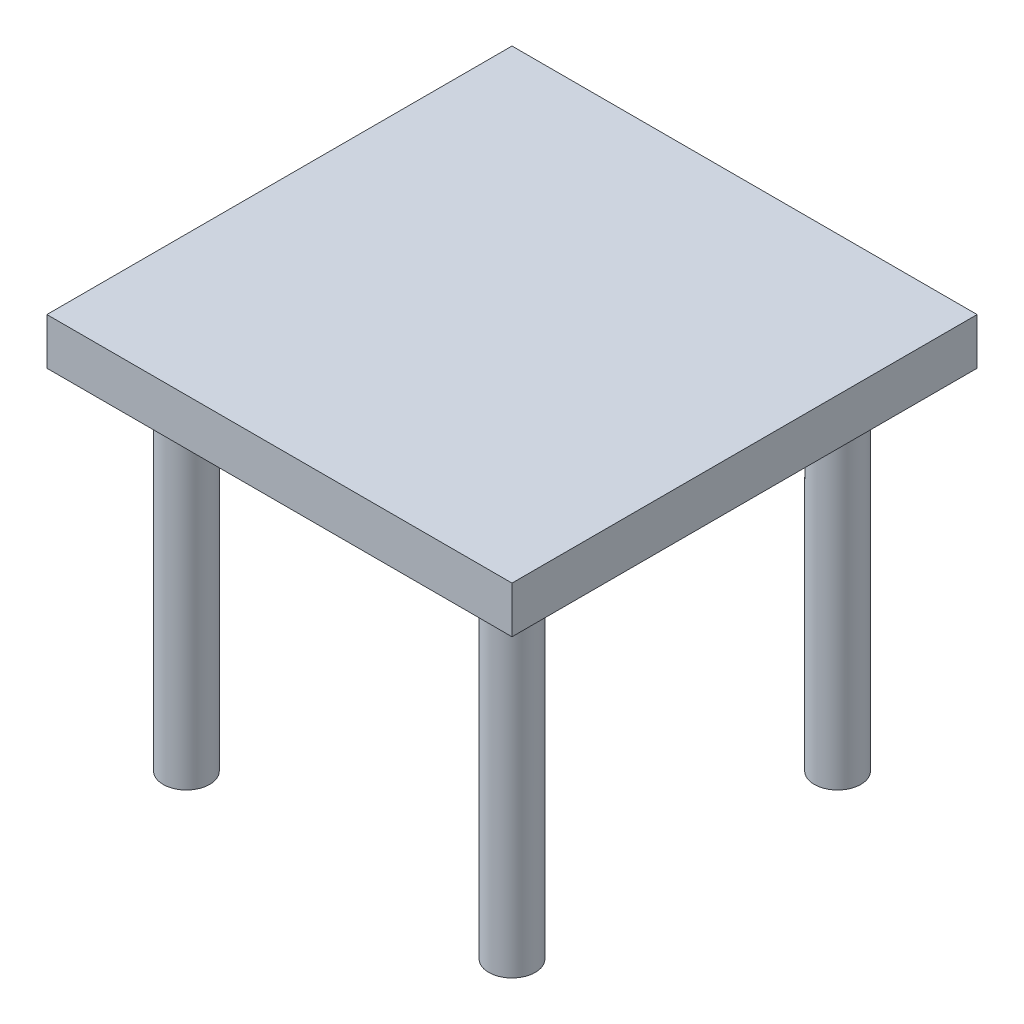
ISO-10303-21;
HEADER;
FILE_DESCRIPTION(('STEP AP214'),'2;1');
FILE_NAME('part.step','',(''),(''),'','','');
FILE_SCHEMA(('AUTOMOTIVE_DESIGN { 1 0 10303 214 1 1 1 1 }'));
ENDSEC;
DATA;
#1=APPLICATION_CONTEXT('core data for automotive mechanical design processes');
#2=APPLICATION_PROTOCOL_DEFINITION('international standard','automotive_design',2000,#1);
#3=PRODUCT_CONTEXT('',#1,'mechanical');
#4=PRODUCT('Part','Part','',(#3));
#5=PRODUCT_RELATED_PRODUCT_CATEGORY('part','',(#4));
#6=PRODUCT_DEFINITION_FORMATION('','',#4);
#7=PRODUCT_DEFINITION_CONTEXT('part definition',#1,'design');
#8=PRODUCT_DEFINITION('design','',#6,#7);
#9=PRODUCT_DEFINITION_SHAPE('','',#8);
#10=(LENGTH_UNIT() NAMED_UNIT(*) SI_UNIT(.MILLI.,.METRE.));
#11=(NAMED_UNIT(*) PLANE_ANGLE_UNIT() SI_UNIT($,.RADIAN.));
#12=(NAMED_UNIT(*) SI_UNIT($,.STERADIAN.) SOLID_ANGLE_UNIT());
#13=UNCERTAINTY_MEASURE_WITH_UNIT(LENGTH_MEASURE(1.E-05),#10,'distance_accuracy_value','');
#14=(GEOMETRIC_REPRESENTATION_CONTEXT(3) GLOBAL_UNCERTAINTY_ASSIGNED_CONTEXT((#13)) GLOBAL_UNIT_ASSIGNED_CONTEXT((#10,
#11,#12)) REPRESENTATION_CONTEXT('',''));
#15=CARTESIAN_POINT('',(0.,0.,0.));
#16=DIRECTION('',(0.,0.,1.));
#17=DIRECTION('',(1.,0.,0.));
#18=AXIS2_PLACEMENT_3D('',#15,#16,#17);
#19=CARTESIAN_POINT('',(-100.,170.,100.));
#20=DIRECTION('',(1.,0.,0.));
#21=DIRECTION('',(0.,0.,-1.));
#22=AXIS2_PLACEMENT_3D('',#19,#20,#21);
#23=PLANE('',#22);
#24=DIRECTION('',(0.,0.,1.));
#25=VECTOR('',#24,1.);
#26=CARTESIAN_POINT('',(-100.,150.,100.));
#27=LINE('',#26,#25);
#28=CARTESIAN_POINT('',(-100.,150.,-100.));
#29=VERTEX_POINT('',#28);
#30=CARTESIAN_POINT('',(-100.,150.,100.));
#31=VERTEX_POINT('',#30);
#32=EDGE_CURVE('E125',#29,#31,#27,.T.);
#33=ORIENTED_EDGE('',*,*,#32,.T.);
#34=DIRECTION('',(0.,-1.,0.));
#35=VECTOR('',#34,1.);
#36=CARTESIAN_POINT('',(-100.,170.,100.));
#37=LINE('',#36,#35);
#38=CARTESIAN_POINT('',(-100.,170.,100.));
#39=VERTEX_POINT('',#38);
#40=EDGE_CURVE('E113',#39,#31,#37,.T.);
#41=ORIENTED_EDGE('',*,*,#40,.F.);
#42=DIRECTION('',(0.,0.,1.));
#43=VECTOR('',#42,1.);
#44=CARTESIAN_POINT('',(-100.,170.,100.));
#45=LINE('',#44,#43);
#46=CARTESIAN_POINT('',(-100.,170.,-100.));
#47=VERTEX_POINT('',#46);
#48=EDGE_CURVE('E105',#47,#39,#45,.T.);
#49=ORIENTED_EDGE('',*,*,#48,.F.);
#50=DIRECTION('',(0.,-1.,0.));
#51=VECTOR('',#50,1.);
#52=CARTESIAN_POINT('',(-100.,170.,-100.));
#53=LINE('',#52,#51);
#54=EDGE_CURVE('E121',#47,#29,#53,.T.);
#55=ORIENTED_EDGE('',*,*,#54,.T.);
#56=EDGE_LOOP('',(#33,#41,#49,#55));
#57=FACE_BOUND('',#56,.T.);
#58=ADVANCED_FACE('F51',(#57),#23,.F.);
#59=CARTESIAN_POINT('',(100.,170.,100.));
#60=DIRECTION('',(0.,0.,-1.));
#61=DIRECTION('',(-1.,0.,0.));
#62=AXIS2_PLACEMENT_3D('',#59,#60,#61);
#63=PLANE('',#62);
#64=DIRECTION('',(1.,0.,0.));
#65=VECTOR('',#64,1.);
#66=CARTESIAN_POINT('',(100.,150.,100.));
#67=LINE('',#66,#65);
#68=CARTESIAN_POINT('',(100.,150.,100.));
#69=VERTEX_POINT('',#68);
#70=EDGE_CURVE('E111',#31,#69,#67,.T.);
#71=ORIENTED_EDGE('',*,*,#70,.T.);
#72=DIRECTION('',(0.,-1.,0.));
#73=VECTOR('',#72,1.);
#74=CARTESIAN_POINT('',(100.,170.,100.));
#75=LINE('',#74,#73);
#76=CARTESIAN_POINT('',(100.,170.,100.));
#77=VERTEX_POINT('',#76);
#78=EDGE_CURVE('E109',#77,#69,#75,.T.);
#79=ORIENTED_EDGE('',*,*,#78,.F.);
#80=DIRECTION('',(1.,0.,0.));
#81=VECTOR('',#80,1.);
#82=CARTESIAN_POINT('',(100.,170.,100.));
#83=LINE('',#82,#81);
#84=EDGE_CURVE('E100',#39,#77,#83,.T.);
#85=ORIENTED_EDGE('',*,*,#84,.F.);
#86=ORIENTED_EDGE('',*,*,#40,.T.);
#87=EDGE_LOOP('',(#71,#79,#85,#86));
#88=FACE_BOUND('',#87,.T.);
#89=ADVANCED_FACE('F110',(#88),#63,.F.);
#90=CARTESIAN_POINT('',(100.,170.,-100.));
#91=DIRECTION('',(-1.,0.,0.));
#92=DIRECTION('',(0.,0.,1.));
#93=AXIS2_PLACEMENT_3D('',#90,#91,#92);
#94=PLANE('',#93);
#95=DIRECTION('',(0.,0.,-1.));
#96=VECTOR('',#95,1.);
#97=CARTESIAN_POINT('',(100.,150.,-100.));
#98=LINE('',#97,#96);
#99=CARTESIAN_POINT('',(100.,150.,-100.));
#100=VERTEX_POINT('',#99);
#101=EDGE_CURVE('E86',#69,#100,#98,.T.);
#102=ORIENTED_EDGE('',*,*,#101,.T.);
#103=DIRECTION('',(0.,-1.,0.));
#104=VECTOR('',#103,1.);
#105=CARTESIAN_POINT('',(100.,170.,-100.));
#106=LINE('',#105,#104);
#107=CARTESIAN_POINT('',(100.,170.,-100.));
#108=VERTEX_POINT('',#107);
#109=EDGE_CURVE('E114',#108,#100,#106,.T.);
#110=ORIENTED_EDGE('',*,*,#109,.F.);
#111=DIRECTION('',(0.,0.,-1.));
#112=VECTOR('',#111,1.);
#113=CARTESIAN_POINT('',(100.,170.,-100.));
#114=LINE('',#113,#112);
#115=EDGE_CURVE('E103',#77,#108,#114,.T.);
#116=ORIENTED_EDGE('',*,*,#115,.F.);
#117=ORIENTED_EDGE('',*,*,#78,.T.);
#118=EDGE_LOOP('',(#102,#110,#116,#117));
#119=FACE_BOUND('',#118,.T.);
#120=ADVANCED_FACE('F116',(#119),#94,.F.);
#121=CARTESIAN_POINT('',(-100.,170.,-100.));
#122=DIRECTION('',(0.,0.,1.));
#123=DIRECTION('',(1.,0.,0.));
#124=AXIS2_PLACEMENT_3D('',#121,#122,#123);
#125=PLANE('',#124);
#126=DIRECTION('',(-1.,0.,0.));
#127=VECTOR('',#126,1.);
#128=CARTESIAN_POINT('',(-100.,150.,-100.));
#129=LINE('',#128,#127);
#130=EDGE_CURVE('E92',#100,#29,#129,.T.);
#131=ORIENTED_EDGE('',*,*,#130,.T.);
#132=ORIENTED_EDGE('',*,*,#54,.F.);
#133=DIRECTION('',(-1.,0.,0.));
#134=VECTOR('',#133,1.);
#135=CARTESIAN_POINT('',(-100.,170.,-100.));
#136=LINE('',#135,#134);
#137=EDGE_CURVE('E69',#108,#47,#136,.T.);
#138=ORIENTED_EDGE('',*,*,#137,.F.);
#139=ORIENTED_EDGE('',*,*,#109,.T.);
#140=EDGE_LOOP('',(#131,#132,#138,#139));
#141=FACE_BOUND('',#140,.T.);
#142=ADVANCED_FACE('F167',(#141),#125,.F.);
#143=CARTESIAN_POINT('',(0.,170.,0.));
#144=DIRECTION('',(0.,-1.,0.));
#145=DIRECTION('',(0.,0.,-1.));
#146=AXIS2_PLACEMENT_3D('',#143,#144,#145);
#147=PLANE('',#146);
#148=ORIENTED_EDGE('',*,*,#48,.T.);
#149=ORIENTED_EDGE('',*,*,#84,.T.);
#150=ORIENTED_EDGE('',*,*,#115,.T.);
#151=ORIENTED_EDGE('',*,*,#137,.T.);
#152=EDGE_LOOP('',(#148,#149,#150,#151));
#153=FACE_BOUND('',#152,.T.);
#154=ADVANCED_FACE('F101',(#153),#147,.F.);
#155=CARTESIAN_POINT('',(0.,150.,0.));
#156=DIRECTION('',(0.,-1.,0.));
#157=DIRECTION('',(0.,0.,-1.));
#158=AXIS2_PLACEMENT_3D('',#155,#156,#157);
#159=PLANE('',#158);
#160=CARTESIAN_POINT('',(70.,150.,-70.));
#161=DIRECTION('',(0.,-1.,0.));
#162=DIRECTION('',(0.,0.,-1.));
#163=AXIS2_PLACEMENT_3D('',#160,#161,#162);
#164=CIRCLE('',#163,9.99999999999999);
#165=CARTESIAN_POINT('',(70.,150.,-80.));
#166=VERTEX_POINT('',#165);
#167=EDGE_CURVE('E11',#166,#166,#164,.T.);
#168=ORIENTED_EDGE('',*,*,#167,.F.);
#169=EDGE_LOOP('',(#168));
#170=FACE_BOUND('',#169,.T.);
#171=CARTESIAN_POINT('',(-70.,150.,70.));
#172=DIRECTION('',(0.,-1.,0.));
#173=DIRECTION('',(0.,0.,-1.));
#174=AXIS2_PLACEMENT_3D('',#171,#172,#173);
#175=CIRCLE('',#174,10.);
#176=CARTESIAN_POINT('',(-70.,150.,60.));
#177=VERTEX_POINT('',#176);
#178=EDGE_CURVE('E61',#177,#177,#175,.T.);
#179=ORIENTED_EDGE('',*,*,#178,.F.);
#180=EDGE_LOOP('',(#179));
#181=FACE_BOUND('',#180,.T.);
#182=CARTESIAN_POINT('',(70.,150.,70.));
#183=DIRECTION('',(0.,-1.,0.));
#184=DIRECTION('',(0.,0.,-1.));
#185=AXIS2_PLACEMENT_3D('',#182,#183,#184);
#186=CIRCLE('',#185,9.99999999999999);
#187=CARTESIAN_POINT('',(70.,150.,60.));
#188=VERTEX_POINT('',#187);
#189=EDGE_CURVE('E145',#188,#188,#186,.T.);
#190=ORIENTED_EDGE('',*,*,#189,.F.);
#191=EDGE_LOOP('',(#190));
#192=FACE_BOUND('',#191,.T.);
#193=CARTESIAN_POINT('',(-70.,150.,-70.));
#194=DIRECTION('',(0.,-1.,0.));
#195=DIRECTION('',(0.,0.,-1.));
#196=AXIS2_PLACEMENT_3D('',#193,#194,#195);
#197=CIRCLE('',#196,10.);
#198=CARTESIAN_POINT('',(-70.,150.,-80.));
#199=VERTEX_POINT('',#198);
#200=EDGE_CURVE('E141',#199,#199,#197,.T.);
#201=ORIENTED_EDGE('',*,*,#200,.F.);
#202=EDGE_LOOP('',(#201));
#203=FACE_BOUND('',#202,.T.);
#204=ORIENTED_EDGE('',*,*,#32,.F.);
#205=ORIENTED_EDGE('',*,*,#130,.F.);
#206=ORIENTED_EDGE('',*,*,#101,.F.);
#207=ORIENTED_EDGE('',*,*,#70,.F.);
#208=EDGE_LOOP('',(#204,#205,#206,#207));
#209=FACE_BOUND('',#208,.T.);
#210=ADVANCED_FACE('F155',(#170,#181,#192,#203,#209),#159,.T.);
#211=CARTESIAN_POINT('',(-70.,0.,-70.));
#212=DIRECTION('',(0.,1.,0.));
#213=DIRECTION('',(0.,0.,1.));
#214=AXIS2_PLACEMENT_3D('',#211,#212,#213);
#215=CYLINDRICAL_SURFACE('',#214,10.);
#216=ORIENTED_EDGE('',*,*,#200,.T.);
#217=EDGE_LOOP('',(#216));
#218=FACE_BOUND('',#217,.T.);
#219=CARTESIAN_POINT('',(-70.,0.,-70.));
#220=DIRECTION('',(0.,1.,0.));
#221=DIRECTION('',(0.,0.,1.));
#222=AXIS2_PLACEMENT_3D('',#219,#220,#221);
#223=CIRCLE('',#222,10.);
#224=CARTESIAN_POINT('',(-70.,0.,-60.));
#225=VERTEX_POINT('',#224);
#226=EDGE_CURVE('E129',#225,#225,#223,.T.);
#227=ORIENTED_EDGE('',*,*,#226,.T.);
#228=EDGE_LOOP('',(#227));
#229=FACE_BOUND('',#228,.T.);
#230=ADVANCED_FACE('F158',(#218,#229),#215,.T.);
#231=CARTESIAN_POINT('',(-70.,0.,-70.));
#232=DIRECTION('',(0.,1.,0.));
#233=DIRECTION('',(0.,0.,1.));
#234=AXIS2_PLACEMENT_3D('',#231,#232,#233);
#235=PLANE('',#234);
#236=ORIENTED_EDGE('',*,*,#226,.F.);
#237=EDGE_LOOP('',(#236));
#238=FACE_BOUND('',#237,.T.);
#239=ADVANCED_FACE('F189',(#238),#235,.F.);
#240=CARTESIAN_POINT('',(70.,0.,70.));
#241=DIRECTION('',(0.,1.,0.));
#242=DIRECTION('',(0.,0.,1.));
#243=AXIS2_PLACEMENT_3D('',#240,#241,#242);
#244=CYLINDRICAL_SURFACE('',#243,9.99999999999999);
#245=ORIENTED_EDGE('',*,*,#189,.T.);
#246=EDGE_LOOP('',(#245));
#247=FACE_BOUND('',#246,.T.);
#248=CARTESIAN_POINT('',(70.,0.,70.));
#249=DIRECTION('',(0.,1.,0.));
#250=DIRECTION('',(0.,0.,1.));
#251=AXIS2_PLACEMENT_3D('',#248,#249,#250);
#252=CIRCLE('',#251,9.99999999999999);
#253=CARTESIAN_POINT('',(70.,0.,80.));
#254=VERTEX_POINT('',#253);
#255=EDGE_CURVE('E224',#254,#254,#252,.T.);
#256=ORIENTED_EDGE('',*,*,#255,.T.);
#257=EDGE_LOOP('',(#256));
#258=FACE_BOUND('',#257,.T.);
#259=ADVANCED_FACE('F193',(#247,#258),#244,.T.);
#260=CARTESIAN_POINT('',(70.,0.,70.));
#261=DIRECTION('',(0.,1.,0.));
#262=DIRECTION('',(0.,0.,1.));
#263=AXIS2_PLACEMENT_3D('',#260,#261,#262);
#264=PLANE('',#263);
#265=ORIENTED_EDGE('',*,*,#255,.F.);
#266=EDGE_LOOP('',(#265));
#267=FACE_BOUND('',#266,.T.);
#268=ADVANCED_FACE('F196',(#267),#264,.F.);
#269=CARTESIAN_POINT('',(-70.,0.,70.));
#270=DIRECTION('',(0.,1.,0.));
#271=DIRECTION('',(0.,0.,1.));
#272=AXIS2_PLACEMENT_3D('',#269,#270,#271);
#273=CYLINDRICAL_SURFACE('',#272,10.);
#274=ORIENTED_EDGE('',*,*,#178,.T.);
#275=EDGE_LOOP('',(#274));
#276=FACE_BOUND('',#275,.T.);
#277=CARTESIAN_POINT('',(-70.,0.,70.));
#278=DIRECTION('',(0.,1.,0.));
#279=DIRECTION('',(0.,0.,1.));
#280=AXIS2_PLACEMENT_3D('',#277,#278,#279);
#281=CIRCLE('',#280,10.);
#282=CARTESIAN_POINT('',(-70.,0.,80.));
#283=VERTEX_POINT('',#282);
#284=EDGE_CURVE('E216',#283,#283,#281,.T.);
#285=ORIENTED_EDGE('',*,*,#284,.T.);
#286=EDGE_LOOP('',(#285));
#287=FACE_BOUND('',#286,.T.);
#288=ADVANCED_FACE('F152',(#276,#287),#273,.T.);
#289=CARTESIAN_POINT('',(-70.,0.,70.));
#290=DIRECTION('',(0.,1.,0.));
#291=DIRECTION('',(0.,0.,1.));
#292=AXIS2_PLACEMENT_3D('',#289,#290,#291);
#293=PLANE('',#292);
#294=ORIENTED_EDGE('',*,*,#284,.F.);
#295=EDGE_LOOP('',(#294));
#296=FACE_BOUND('',#295,.T.);
#297=ADVANCED_FACE('F202',(#296),#293,.F.);
#298=CARTESIAN_POINT('',(70.,0.,-70.));
#299=DIRECTION('',(0.,1.,0.));
#300=DIRECTION('',(0.,0.,1.));
#301=AXIS2_PLACEMENT_3D('',#298,#299,#300);
#302=CYLINDRICAL_SURFACE('',#301,9.99999999999999);
#303=ORIENTED_EDGE('',*,*,#167,.T.);
#304=EDGE_LOOP('',(#303));
#305=FACE_BOUND('',#304,.T.);
#306=CARTESIAN_POINT('',(70.,0.,-70.));
#307=DIRECTION('',(0.,1.,0.));
#308=DIRECTION('',(0.,0.,1.));
#309=AXIS2_PLACEMENT_3D('',#306,#307,#308);
#310=CIRCLE('',#309,9.99999999999999);
#311=CARTESIAN_POINT('',(70.,0.,-60.));
#312=VERTEX_POINT('',#311);
#313=EDGE_CURVE('E213',#312,#312,#310,.T.);
#314=ORIENTED_EDGE('',*,*,#313,.T.);
#315=EDGE_LOOP('',(#314));
#316=FACE_BOUND('',#315,.T.);
#317=ADVANCED_FACE('F204',(#305,#316),#302,.T.);
#318=CARTESIAN_POINT('',(70.,0.,-70.));
#319=DIRECTION('',(0.,1.,0.));
#320=DIRECTION('',(0.,0.,1.));
#321=AXIS2_PLACEMENT_3D('',#318,#319,#320);
#322=PLANE('',#321);
#323=ORIENTED_EDGE('',*,*,#313,.F.);
#324=EDGE_LOOP('',(#323));
#325=FACE_BOUND('',#324,.T.);
#326=ADVANCED_FACE('F205',(#325),#322,.F.);
#327=CLOSED_SHELL('',(#58,#89,#120,#142,#154,#210,#230,#239,#259,#268,#288,#297,#317,#326));
#328=MANIFOLD_SOLID_BREP('B2',#327);
#329=ADVANCED_BREP_SHAPE_REPRESENTATION('',(#18,#328),#14);
#330=SHAPE_DEFINITION_REPRESENTATION(#9,#329);
ENDSEC;
END-ISO-10303-21;
